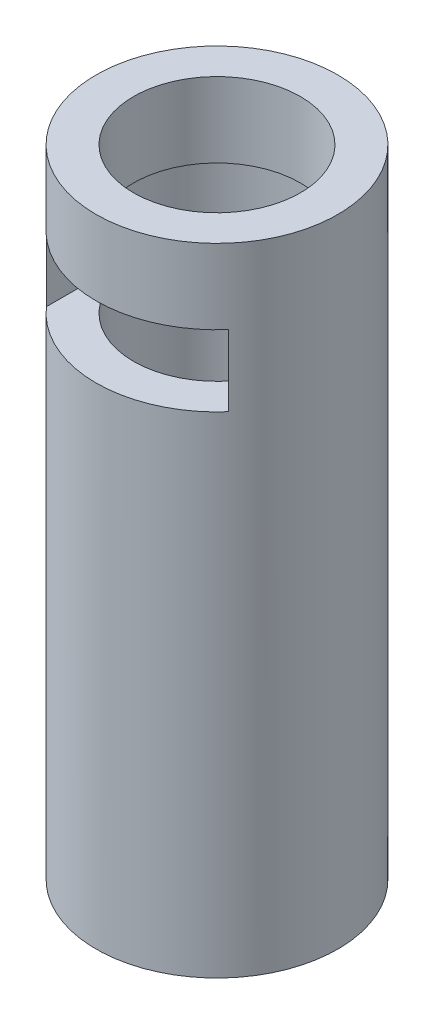
ISO-10303-21;
HEADER;
FILE_DESCRIPTION(('STEP AP214'),'2;1');
FILE_NAME('part.step','',(''),(''),'','','');
FILE_SCHEMA(('AUTOMOTIVE_DESIGN { 1 0 10303 214 1 1 1 1 }'));
ENDSEC;
DATA;
#1=APPLICATION_CONTEXT('core data for automotive mechanical design processes');
#2=APPLICATION_PROTOCOL_DEFINITION('international standard','automotive_design',2000,#1);
#3=PRODUCT_CONTEXT('',#1,'mechanical');
#4=PRODUCT('Part','Part','',(#3));
#5=PRODUCT_RELATED_PRODUCT_CATEGORY('part','',(#4));
#6=PRODUCT_DEFINITION_FORMATION('','',#4);
#7=PRODUCT_DEFINITION_CONTEXT('part definition',#1,'design');
#8=PRODUCT_DEFINITION('design','',#6,#7);
#9=PRODUCT_DEFINITION_SHAPE('','',#8);
#10=(LENGTH_UNIT() NAMED_UNIT(*) SI_UNIT(.MILLI.,.METRE.));
#11=(NAMED_UNIT(*) PLANE_ANGLE_UNIT() SI_UNIT($,.RADIAN.));
#12=(NAMED_UNIT(*) SI_UNIT($,.STERADIAN.) SOLID_ANGLE_UNIT());
#13=UNCERTAINTY_MEASURE_WITH_UNIT(LENGTH_MEASURE(1.E-05),#10,'distance_accuracy_value','');
#14=(GEOMETRIC_REPRESENTATION_CONTEXT(3) GLOBAL_UNCERTAINTY_ASSIGNED_CONTEXT((#13)) GLOBAL_UNIT_ASSIGNED_CONTEXT((#10,
#11,#12)) REPRESENTATION_CONTEXT('',''));
#15=CARTESIAN_POINT('',(0.,0.,0.));
#16=DIRECTION('',(0.,0.,1.));
#17=DIRECTION('',(1.,0.,0.));
#18=AXIS2_PLACEMENT_3D('',#15,#16,#17);
#19=CARTESIAN_POINT('',(0.,80.,0.));
#20=DIRECTION('',(0.,-1.,0.));
#21=DIRECTION('',(0.,0.,-1.));
#22=AXIS2_PLACEMENT_3D('',#19,#20,#21);
#23=CYLINDRICAL_SURFACE('',#22,16.15);
#24=CARTESIAN_POINT('',(0.,-5.,0.));
#25=DIRECTION('',(0.,-1.,0.));
#26=DIRECTION('',(0.,0.,-1.));
#27=AXIS2_PLACEMENT_3D('',#24,#25,#26);
#28=CIRCLE('',#27,16.15);
#29=CARTESIAN_POINT('',(0.,-5.,-16.15));
#30=VERTEX_POINT('',#29);
#31=EDGE_CURVE('E110',#30,#30,#28,.T.);
#32=ORIENTED_EDGE('',*,*,#31,.F.);
#33=EDGE_LOOP('',(#32));
#34=FACE_BOUND('',#33,.T.);
#35=CARTESIAN_POINT('',(0.,80.,0.));
#36=DIRECTION('',(0.,1.,0.));
#37=DIRECTION('',(0.,0.,1.));
#38=AXIS2_PLACEMENT_3D('',#35,#36,#37);
#39=CIRCLE('',#38,16.15);
#40=CARTESIAN_POINT('',(0.,80.,16.15));
#41=VERTEX_POINT('',#40);
#42=EDGE_CURVE('E119',#41,#41,#39,.T.);
#43=ORIENTED_EDGE('',*,*,#42,.F.);
#44=EDGE_LOOP('',(#43));
#45=FACE_BOUND('',#44,.T.);
#46=CARTESIAN_POINT('',(0.,60.5,0.));
#47=DIRECTION('',(0.,1.,0.));
#48=DIRECTION('',(0.,0.,1.));
#49=AXIS2_PLACEMENT_3D('',#46,#47,#48);
#50=CIRCLE('',#49,16.15);
#51=CARTESIAN_POINT('',(-12.15,60.5,10.6395488626163));
#52=VERTEX_POINT('',#51);
#53=CARTESIAN_POINT('',(12.15,60.5,10.6395488626163));
#54=VERTEX_POINT('',#53);
#55=EDGE_CURVE('E104',#52,#54,#50,.T.);
#56=ORIENTED_EDGE('',*,*,#55,.F.);
#57=DIRECTION('',(0.,-1.,0.));
#58=VECTOR('',#57,1.);
#59=CARTESIAN_POINT('',(-12.15,80.,10.6395488626163));
#60=LINE('',#59,#58);
#61=CARTESIAN_POINT('',(-12.15,70.,10.6395488626163));
#62=VERTEX_POINT('',#61);
#63=EDGE_CURVE('E39',#52,#62,#60,.F.);
#64=ORIENTED_EDGE('',*,*,#63,.T.);
#65=CARTESIAN_POINT('',(0.,70.,0.));
#66=DIRECTION('',(0.,1.,0.));
#67=DIRECTION('',(0.,0.,1.));
#68=AXIS2_PLACEMENT_3D('',#65,#66,#67);
#69=CIRCLE('',#68,16.15);
#70=CARTESIAN_POINT('',(12.15,70.,10.6395488626163));
#71=VERTEX_POINT('',#70);
#72=EDGE_CURVE('E100',#62,#71,#69,.T.);
#73=ORIENTED_EDGE('',*,*,#72,.T.);
#74=DIRECTION('',(0.,-1.,0.));
#75=VECTOR('',#74,1.);
#76=CARTESIAN_POINT('',(12.15,80.,10.6395488626163));
#77=LINE('',#76,#75);
#78=EDGE_CURVE('E11',#71,#54,#77,.T.);
#79=ORIENTED_EDGE('',*,*,#78,.T.);
#80=EDGE_LOOP('',(#56,#64,#73,#79));
#81=FACE_BOUND('',#80,.T.);
#82=ADVANCED_FACE('F32',(#34,#45,#81),#23,.T.);
#83=CARTESIAN_POINT('',(0.,80.,0.));
#84=DIRECTION('',(0.,-1.,0.));
#85=DIRECTION('',(0.,0.,-1.));
#86=AXIS2_PLACEMENT_3D('',#83,#84,#85);
#87=CYLINDRICAL_SURFACE('',#86,11.15);
#88=CARTESIAN_POINT('',(0.,0.,0.));
#89=DIRECTION('',(0.,1.,0.));
#90=DIRECTION('',(0.,0.,1.));
#91=AXIS2_PLACEMENT_3D('',#88,#89,#90);
#92=CIRCLE('',#91,11.15);
#93=CARTESIAN_POINT('',(0.,0.,11.15));
#94=VERTEX_POINT('',#93);
#95=EDGE_CURVE('E115',#94,#94,#92,.T.);
#96=ORIENTED_EDGE('',*,*,#95,.F.);
#97=EDGE_LOOP('',(#96));
#98=FACE_BOUND('',#97,.T.);
#99=CARTESIAN_POINT('',(0.,60.5,0.));
#100=DIRECTION('',(0.,1.,0.));
#101=DIRECTION('',(0.,0.,1.));
#102=AXIS2_PLACEMENT_3D('',#99,#100,#101);
#103=CIRCLE('',#102,11.15);
#104=CARTESIAN_POINT('',(0.,60.5,11.15));
#105=VERTEX_POINT('',#104);
#106=EDGE_CURVE('E103',#105,#105,#103,.T.);
#107=ORIENTED_EDGE('',*,*,#106,.T.);
#108=EDGE_LOOP('',(#107));
#109=FACE_BOUND('',#108,.T.);
#110=ADVANCED_FACE('F143',(#98,#109),#87,.F.);
#111=CARTESIAN_POINT('',(0.,80.,0.));
#112=DIRECTION('',(0.,1.,0.));
#113=DIRECTION('',(0.,0.,1.));
#114=AXIS2_PLACEMENT_3D('',#111,#112,#113);
#115=PLANE('',#114);
#116=ORIENTED_EDGE('',*,*,#42,.T.);
#117=EDGE_LOOP('',(#116));
#118=FACE_BOUND('',#117,.T.);
#119=CARTESIAN_POINT('',(0.,80.,0.));
#120=DIRECTION('',(0.,1.,0.));
#121=DIRECTION('',(0.,0.,1.));
#122=AXIS2_PLACEMENT_3D('',#119,#120,#121);
#123=CIRCLE('',#122,11.15);
#124=CARTESIAN_POINT('',(0.,80.,11.15));
#125=VERTEX_POINT('',#124);
#126=EDGE_CURVE('E116',#125,#125,#123,.T.);
#127=ORIENTED_EDGE('',*,*,#126,.F.);
#128=EDGE_LOOP('',(#127));
#129=FACE_BOUND('',#128,.T.);
#130=ADVANCED_FACE('F148',(#118,#129),#115,.T.);
#131=CARTESIAN_POINT('',(0.,70.,0.));
#132=DIRECTION('',(0.,1.,0.));
#133=DIRECTION('',(0.,0.,1.));
#134=AXIS2_PLACEMENT_3D('',#131,#132,#133);
#135=CIRCLE('',#134,11.15);
#136=CARTESIAN_POINT('',(0.,70.,11.15));
#137=VERTEX_POINT('',#136);
#138=EDGE_CURVE('E98',#137,#137,#135,.T.);
#139=ORIENTED_EDGE('',*,*,#138,.F.);
#140=EDGE_LOOP('',(#139));
#141=FACE_BOUND('',#140,.T.);
#142=ORIENTED_EDGE('',*,*,#126,.T.);
#143=EDGE_LOOP('',(#142));
#144=FACE_BOUND('',#143,.T.);
#145=ADVANCED_FACE('F151',(#141,#144),#87,.F.);
#146=CARTESIAN_POINT('',(0.,0.,0.));
#147=DIRECTION('',(0.,-1.,0.));
#148=DIRECTION('',(0.,0.,-1.));
#149=AXIS2_PLACEMENT_3D('',#146,#147,#148);
#150=PLANE('',#149);
#151=CARTESIAN_POINT('',(0.,0.,0.));
#152=DIRECTION('',(0.,-1.,0.));
#153=DIRECTION('',(0.,0.,-1.));
#154=AXIS2_PLACEMENT_3D('',#151,#152,#153);
#155=CIRCLE('',#154,9.15);
#156=CARTESIAN_POINT('',(0.,0.,-9.15));
#157=VERTEX_POINT('',#156);
#158=EDGE_CURVE('E106',#157,#157,#155,.T.);
#159=ORIENTED_EDGE('',*,*,#158,.T.);
#160=EDGE_LOOP('',(#159));
#161=FACE_BOUND('',#160,.T.);
#162=ORIENTED_EDGE('',*,*,#95,.T.);
#163=EDGE_LOOP('',(#162));
#164=FACE_BOUND('',#163,.T.);
#165=ADVANCED_FACE('F161',(#161,#164),#150,.F.);
#166=CARTESIAN_POINT('',(0.,-5.,0.));
#167=DIRECTION('',(0.,-1.,0.));
#168=DIRECTION('',(0.,0.,-1.));
#169=AXIS2_PLACEMENT_3D('',#166,#167,#168);
#170=PLANE('',#169);
#171=ORIENTED_EDGE('',*,*,#31,.T.);
#172=EDGE_LOOP('',(#171));
#173=FACE_BOUND('',#172,.T.);
#174=CARTESIAN_POINT('',(0.,-5.,0.));
#175=DIRECTION('',(0.,-1.,0.));
#176=DIRECTION('',(0.,0.,-1.));
#177=AXIS2_PLACEMENT_3D('',#174,#175,#176);
#178=CIRCLE('',#177,9.15);
#179=CARTESIAN_POINT('',(0.,-5.,-9.15));
#180=VERTEX_POINT('',#179);
#181=EDGE_CURVE('E107',#180,#180,#178,.T.);
#182=ORIENTED_EDGE('',*,*,#181,.F.);
#183=EDGE_LOOP('',(#182));
#184=FACE_BOUND('',#183,.T.);
#185=ADVANCED_FACE('F166',(#173,#184),#170,.T.);
#186=CARTESIAN_POINT('',(0.,-5.,0.));
#187=DIRECTION('',(0.,1.,0.));
#188=DIRECTION('',(0.,0.,1.));
#189=AXIS2_PLACEMENT_3D('',#186,#187,#188);
#190=CYLINDRICAL_SURFACE('',#189,9.15);
#191=ORIENTED_EDGE('',*,*,#181,.T.);
#192=EDGE_LOOP('',(#191));
#193=FACE_BOUND('',#192,.T.);
#194=ORIENTED_EDGE('',*,*,#158,.F.);
#195=EDGE_LOOP('',(#194));
#196=FACE_BOUND('',#195,.T.);
#197=ADVANCED_FACE('F173',(#193,#196),#190,.F.);
#198=CARTESIAN_POINT('',(12.15,60.5,0.));
#199=DIRECTION('',(1.,0.,0.));
#200=DIRECTION('',(0.,0.,-1.));
#201=AXIS2_PLACEMENT_3D('',#198,#199,#200);
#202=PLANE('',#201);
#203=DIRECTION('',(0.,0.,-1.));
#204=VECTOR('',#203,1.);
#205=CARTESIAN_POINT('',(12.15,70.,0.));
#206=LINE('',#205,#204);
#207=CARTESIAN_POINT('',(12.15,70.,0.));
#208=VERTEX_POINT('',#207);
#209=EDGE_CURVE('E46',#71,#208,#206,.T.);
#210=ORIENTED_EDGE('',*,*,#209,.T.);
#211=DIRECTION('',(0.,1.,0.));
#212=VECTOR('',#211,1.);
#213=CARTESIAN_POINT('',(12.15,60.5,0.));
#214=LINE('',#213,#212);
#215=CARTESIAN_POINT('',(12.15,60.5,0.));
#216=VERTEX_POINT('',#215);
#217=EDGE_CURVE('E80',#216,#208,#214,.T.);
#218=ORIENTED_EDGE('',*,*,#217,.F.);
#219=DIRECTION('',(0.,0.,-1.));
#220=VECTOR('',#219,1.);
#221=CARTESIAN_POINT('',(12.15,60.5,0.));
#222=LINE('',#221,#220);
#223=EDGE_CURVE('E81',#54,#216,#222,.T.);
#224=ORIENTED_EDGE('',*,*,#223,.F.);
#225=ORIENTED_EDGE('',*,*,#78,.F.);
#226=EDGE_LOOP('',(#210,#218,#224,#225));
#227=FACE_BOUND('',#226,.T.);
#228=ADVANCED_FACE('F129',(#227),#202,.F.);
#229=CARTESIAN_POINT('',(-12.15,60.5,0.));
#230=DIRECTION('',(-1.,0.,0.));
#231=DIRECTION('',(0.,0.,1.));
#232=AXIS2_PLACEMENT_3D('',#229,#230,#231);
#233=PLANE('',#232);
#234=DIRECTION('',(0.,0.,1.));
#235=VECTOR('',#234,1.);
#236=CARTESIAN_POINT('',(-12.15,60.5,0.));
#237=LINE('',#236,#235);
#238=CARTESIAN_POINT('',(-12.15,60.5,0.));
#239=VERTEX_POINT('',#238);
#240=EDGE_CURVE('E83',#239,#52,#237,.T.);
#241=ORIENTED_EDGE('',*,*,#240,.F.);
#242=DIRECTION('',(0.,1.,0.));
#243=VECTOR('',#242,1.);
#244=CARTESIAN_POINT('',(-12.15,60.5,0.));
#245=LINE('',#244,#243);
#246=CARTESIAN_POINT('',(-12.15,70.,0.));
#247=VERTEX_POINT('',#246);
#248=EDGE_CURVE('E73',#239,#247,#245,.T.);
#249=ORIENTED_EDGE('',*,*,#248,.T.);
#250=DIRECTION('',(0.,0.,1.));
#251=VECTOR('',#250,1.);
#252=CARTESIAN_POINT('',(-12.15,70.,0.));
#253=LINE('',#252,#251);
#254=EDGE_CURVE('E92',#247,#62,#253,.T.);
#255=ORIENTED_EDGE('',*,*,#254,.T.);
#256=ORIENTED_EDGE('',*,*,#63,.F.);
#257=EDGE_LOOP('',(#241,#249,#255,#256));
#258=FACE_BOUND('',#257,.T.);
#259=ADVANCED_FACE('F84',(#258),#233,.F.);
#260=CARTESIAN_POINT('',(0.,60.5,0.));
#261=DIRECTION('',(0.,1.,0.));
#262=DIRECTION('',(0.,0.,1.));
#263=AXIS2_PLACEMENT_3D('',#260,#261,#262);
#264=PLANE('',#263);
#265=ORIENTED_EDGE('',*,*,#106,.F.);
#266=EDGE_LOOP('',(#265));
#267=FACE_BOUND('',#266,.T.);
#268=ORIENTED_EDGE('',*,*,#55,.T.);
#269=ORIENTED_EDGE('',*,*,#223,.T.);
#270=CARTESIAN_POINT('',(0.,60.5,0.));
#271=DIRECTION('',(0.,1.,0.));
#272=DIRECTION('',(0.,0.,1.));
#273=AXIS2_PLACEMENT_3D('',#270,#271,#272);
#274=CIRCLE('',#273,12.15);
#275=EDGE_CURVE('E77',#216,#239,#274,.T.);
#276=ORIENTED_EDGE('',*,*,#275,.T.);
#277=ORIENTED_EDGE('',*,*,#240,.T.);
#278=EDGE_LOOP('',(#268,#269,#276,#277));
#279=FACE_BOUND('',#278,.T.);
#280=ADVANCED_FACE('F88',(#267,#279),#264,.T.);
#281=CARTESIAN_POINT('',(0.,70.,0.));
#282=DIRECTION('',(0.,1.,0.));
#283=DIRECTION('',(0.,0.,1.));
#284=AXIS2_PLACEMENT_3D('',#281,#282,#283);
#285=PLANE('',#284);
#286=ORIENTED_EDGE('',*,*,#138,.T.);
#287=EDGE_LOOP('',(#286));
#288=FACE_BOUND('',#287,.T.);
#289=ORIENTED_EDGE('',*,*,#254,.F.);
#290=CARTESIAN_POINT('',(0.,70.,0.));
#291=DIRECTION('',(0.,1.,0.));
#292=DIRECTION('',(0.,0.,1.));
#293=AXIS2_PLACEMENT_3D('',#290,#291,#292);
#294=CIRCLE('',#293,12.15);
#295=EDGE_CURVE('E78',#208,#247,#294,.T.);
#296=ORIENTED_EDGE('',*,*,#295,.F.);
#297=ORIENTED_EDGE('',*,*,#209,.F.);
#298=ORIENTED_EDGE('',*,*,#72,.F.);
#299=EDGE_LOOP('',(#289,#296,#297,#298));
#300=FACE_BOUND('',#299,.T.);
#301=ADVANCED_FACE('F130',(#288,#300),#285,.F.);
#302=CARTESIAN_POINT('',(0.,60.5,0.));
#303=DIRECTION('',(0.,1.,0.));
#304=DIRECTION('',(0.,0.,1.));
#305=AXIS2_PLACEMENT_3D('',#302,#303,#304);
#306=CYLINDRICAL_SURFACE('',#305,12.15);
#307=ORIENTED_EDGE('',*,*,#295,.T.);
#308=ORIENTED_EDGE('',*,*,#248,.F.);
#309=ORIENTED_EDGE('',*,*,#275,.F.);
#310=ORIENTED_EDGE('',*,*,#217,.T.);
#311=EDGE_LOOP('',(#307,#308,#309,#310));
#312=FACE_BOUND('',#311,.T.);
#313=ADVANCED_FACE('F74',(#312),#306,.F.);
#314=CLOSED_SHELL('',(#82,#110,#130,#145,#165,#185,#197,#228,#259,#280,#301,#313));
#315=MANIFOLD_SOLID_BREP('B2',#314);
#316=ADVANCED_BREP_SHAPE_REPRESENTATION('',(#18,#315),#14);
#317=SHAPE_DEFINITION_REPRESENTATION(#9,#316);
ENDSEC;
END-ISO-10303-21;
